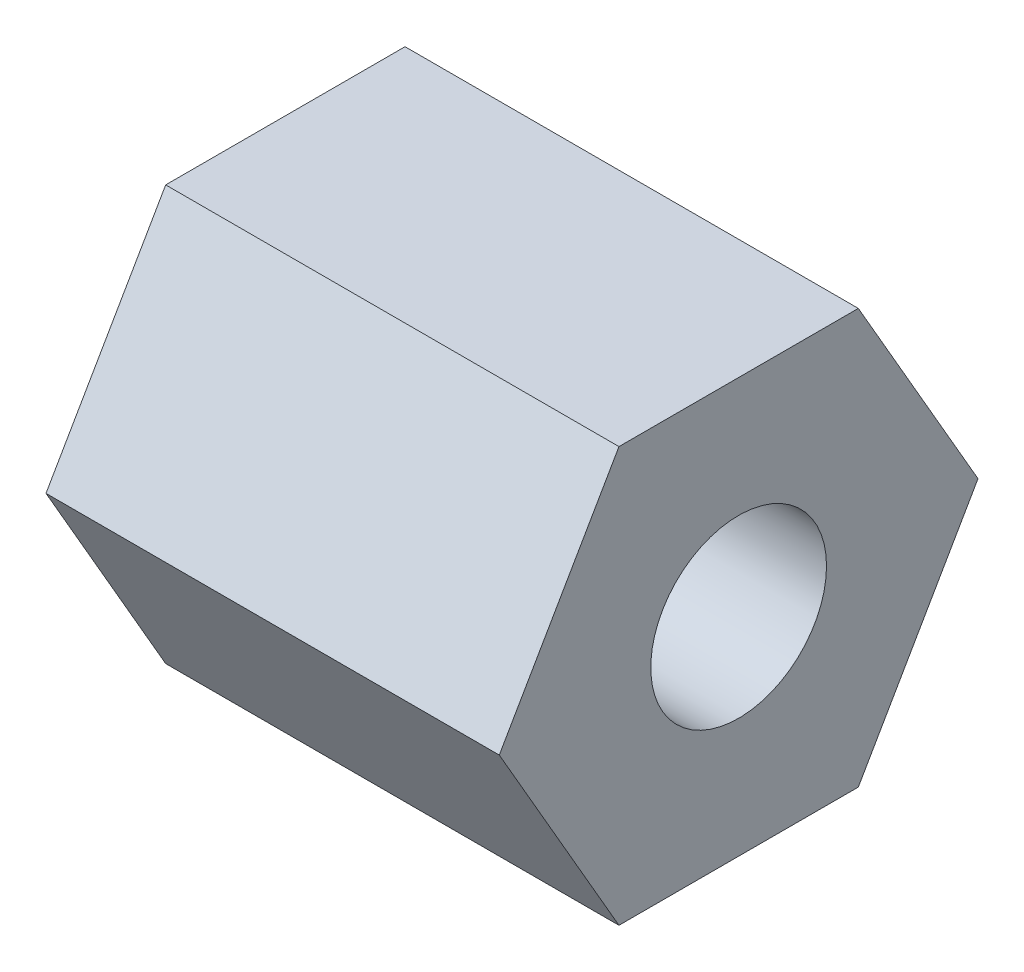
ISO-10303-21;
HEADER;
FILE_DESCRIPTION(('STEP AP214'),'2;1');
FILE_NAME('part.step','',(''),(''),'','','');
FILE_SCHEMA(('AUTOMOTIVE_DESIGN { 1 0 10303 214 1 1 1 1 }'));
ENDSEC;
DATA;
#1=APPLICATION_CONTEXT('core data for automotive mechanical design processes');
#2=APPLICATION_PROTOCOL_DEFINITION('international standard','automotive_design',2000,#1);
#3=PRODUCT_CONTEXT('',#1,'mechanical');
#4=PRODUCT('Part','Part','',(#3));
#5=PRODUCT_RELATED_PRODUCT_CATEGORY('part','',(#4));
#6=PRODUCT_DEFINITION_FORMATION('','',#4);
#7=PRODUCT_DEFINITION_CONTEXT('part definition',#1,'design');
#8=PRODUCT_DEFINITION('design','',#6,#7);
#9=PRODUCT_DEFINITION_SHAPE('','',#8);
#10=(LENGTH_UNIT() NAMED_UNIT(*) SI_UNIT(.MILLI.,.METRE.));
#11=(NAMED_UNIT(*) PLANE_ANGLE_UNIT() SI_UNIT($,.RADIAN.));
#12=(NAMED_UNIT(*) SI_UNIT($,.STERADIAN.) SOLID_ANGLE_UNIT());
#13=UNCERTAINTY_MEASURE_WITH_UNIT(LENGTH_MEASURE(1.E-05),#10,'distance_accuracy_value','');
#14=(GEOMETRIC_REPRESENTATION_CONTEXT(3) GLOBAL_UNCERTAINTY_ASSIGNED_CONTEXT((#13)) GLOBAL_UNIT_ASSIGNED_CONTEXT((#10,
#11,#12)) REPRESENTATION_CONTEXT('',''));
#15=CARTESIAN_POINT('',(0.,0.,0.));
#16=DIRECTION('',(0.,0.,1.));
#17=DIRECTION('',(1.,0.,0.));
#18=AXIS2_PLACEMENT_3D('',#15,#16,#17);
#19=CARTESIAN_POINT('',(38.1,0.,0.));
#20=DIRECTION('',(1.,0.,0.));
#21=DIRECTION('',(0.,1.,0.));
#22=AXIS2_PLACEMENT_3D('',#19,#20,#21);
#23=PLANE('',#22);
#24=CARTESIAN_POINT('',(38.1,0.,0.));
#25=DIRECTION('',(1.,0.,0.));
#26=DIRECTION('',(0.,0.,-1.));
#27=AXIS2_PLACEMENT_3D('',#24,#25,#26);
#28=CIRCLE('',#27,2.0193);
#29=CARTESIAN_POINT('',(38.1,0.,-2.0193));
#30=VERTEX_POINT('',#29);
#31=EDGE_CURVE('E126',#30,#30,#28,.T.);
#32=ORIENTED_EDGE('',*,*,#31,.F.);
#33=EDGE_LOOP('',(#32));
#34=FACE_BOUND('',#33,.T.);
#35=DIRECTION('',(0.,0.866025403784442,-0.5));
#36=VECTOR('',#35,1.);
#37=CARTESIAN_POINT('',(38.1,-4.7625,-2.74963065701564));
#38=LINE('',#37,#36);
#39=CARTESIAN_POINT('',(38.1,-4.7625,-2.74963065701564));
#40=VERTEX_POINT('',#39);
#41=CARTESIAN_POINT('',(38.1,0.,-5.49926131403117));
#42=VERTEX_POINT('',#41);
#43=EDGE_CURVE('E151',#40,#42,#38,.T.);
#44=ORIENTED_EDGE('',*,*,#43,.T.);
#45=DIRECTION('',(0.,0.866025403784438,0.5));
#46=VECTOR('',#45,1.);
#47=CARTESIAN_POINT('',(38.1,0.,-5.49926131403117));
#48=LINE('',#47,#46);
#49=CARTESIAN_POINT('',(38.1,4.7625,-2.74963065701557));
#50=VERTEX_POINT('',#49);
#51=EDGE_CURVE('E99',#42,#50,#48,.T.);
#52=ORIENTED_EDGE('',*,*,#51,.T.);
#53=DIRECTION('',(0.,0.,1.));
#54=VECTOR('',#53,1.);
#55=CARTESIAN_POINT('',(38.1,4.7625,-2.74963065701557));
#56=LINE('',#55,#54);
#57=CARTESIAN_POINT('',(38.1,4.7625,2.7496306570156));
#58=VERTEX_POINT('',#57);
#59=EDGE_CURVE('E140',#50,#58,#56,.T.);
#60=ORIENTED_EDGE('',*,*,#59,.T.);
#61=DIRECTION('',(0.,-0.866025403784442,0.5));
#62=VECTOR('',#61,1.);
#63=CARTESIAN_POINT('',(38.1,4.7625,2.7496306570156));
#64=LINE('',#63,#62);
#65=CARTESIAN_POINT('',(38.1,0.,5.49926131403117));
#66=VERTEX_POINT('',#65);
#67=EDGE_CURVE('E139',#58,#66,#64,.T.);
#68=ORIENTED_EDGE('',*,*,#67,.T.);
#69=DIRECTION('',(0.,-0.866025403784435,-0.500000000000007));
#70=VECTOR('',#69,1.);
#71=CARTESIAN_POINT('',(38.1,0.,5.49926131403117));
#72=LINE('',#71,#70);
#73=CARTESIAN_POINT('',(38.1,-4.7625,2.74963065701554));
#74=VERTEX_POINT('',#73);
#75=EDGE_CURVE('E56',#66,#74,#72,.T.);
#76=ORIENTED_EDGE('',*,*,#75,.T.);
#77=DIRECTION('',(0.,0.,-1.));
#78=VECTOR('',#77,1.);
#79=CARTESIAN_POINT('',(38.1,-4.7625,2.74963065701554));
#80=LINE('',#79,#78);
#81=EDGE_CURVE('E11',#74,#40,#80,.T.);
#82=ORIENTED_EDGE('',*,*,#81,.T.);
#83=EDGE_LOOP('',(#44,#52,#60,#68,#76,#82));
#84=FACE_BOUND('',#83,.T.);
#85=ADVANCED_FACE('F46',(#34,#84),#23,.T.);
#86=CARTESIAN_POINT('',(38.1,-4.7625,2.74963065701554));
#87=DIRECTION('',(0.,1.,0.));
#88=DIRECTION('',(0.,0.,-1.));
#89=AXIS2_PLACEMENT_3D('',#86,#87,#88);
#90=PLANE('',#89);
#91=DIRECTION('',(-1.,0.,0.));
#92=VECTOR('',#91,1.);
#93=CARTESIAN_POINT('',(38.1,-4.7625,2.74963065701554));
#94=LINE('',#93,#92);
#95=CARTESIAN_POINT('',(27.686,-4.7625,2.74963065701555));
#96=VERTEX_POINT('',#95);
#97=EDGE_CURVE('E145',#74,#96,#94,.T.);
#98=ORIENTED_EDGE('',*,*,#97,.T.);
#99=DIRECTION('',(0.,0.,-1.));
#100=VECTOR('',#99,1.);
#101=CARTESIAN_POINT('',(27.686,-4.7625,2.74963065701554));
#102=LINE('',#101,#100);
#103=CARTESIAN_POINT('',(27.686,-4.7625,-2.74963065701564));
#104=VERTEX_POINT('',#103);
#105=EDGE_CURVE('E121',#96,#104,#102,.T.);
#106=ORIENTED_EDGE('',*,*,#105,.T.);
#107=DIRECTION('',(-1.,0.,0.));
#108=VECTOR('',#107,1.);
#109=CARTESIAN_POINT('',(38.1,-4.7625,-2.74963065701564));
#110=LINE('',#109,#108);
#111=EDGE_CURVE('E154',#40,#104,#110,.T.);
#112=ORIENTED_EDGE('',*,*,#111,.F.);
#113=ORIENTED_EDGE('',*,*,#81,.F.);
#114=EDGE_LOOP('',(#98,#106,#112,#113));
#115=FACE_BOUND('',#114,.T.);
#116=ADVANCED_FACE('F175',(#115),#90,.F.);
#117=CARTESIAN_POINT('',(38.1,0.,5.49926131403117));
#118=DIRECTION('',(0.,0.500000000000007,-0.866025403784435));
#119=DIRECTION('',(-1.,0.,0.));
#120=AXIS2_PLACEMENT_3D('',#117,#118,#119);
#121=PLANE('',#120);
#122=DIRECTION('',(-1.,0.,0.));
#123=VECTOR('',#122,1.);
#124=CARTESIAN_POINT('',(38.1,0.,5.49926131403117));
#125=LINE('',#124,#123);
#126=CARTESIAN_POINT('',(27.686,0.,5.49926131403121));
#127=VERTEX_POINT('',#126);
#128=EDGE_CURVE('E132',#66,#127,#125,.T.);
#129=ORIENTED_EDGE('',*,*,#128,.T.);
#130=DIRECTION('',(0.,-0.866025403784435,-0.500000000000007));
#131=VECTOR('',#130,1.);
#132=CARTESIAN_POINT('',(27.686,0.,5.49926131403117));
#133=LINE('',#132,#131);
#134=EDGE_CURVE('E115',#127,#96,#133,.T.);
#135=ORIENTED_EDGE('',*,*,#134,.T.);
#136=ORIENTED_EDGE('',*,*,#97,.F.);
#137=ORIENTED_EDGE('',*,*,#75,.F.);
#138=EDGE_LOOP('',(#129,#135,#136,#137));
#139=FACE_BOUND('',#138,.T.);
#140=ADVANCED_FACE('F48',(#139),#121,.F.);
#141=CARTESIAN_POINT('',(38.1,4.7625,2.7496306570156));
#142=DIRECTION('',(0.,-0.5,-0.866025403784442));
#143=DIRECTION('',(0.,-0.866025403784442,0.5));
#144=AXIS2_PLACEMENT_3D('',#141,#142,#143);
#145=PLANE('',#144);
#146=DIRECTION('',(-1.,0.,0.));
#147=VECTOR('',#146,1.);
#148=CARTESIAN_POINT('',(38.1,4.7625,2.7496306570156));
#149=LINE('',#148,#147);
#150=CARTESIAN_POINT('',(27.686,4.76249999999998,2.74963065701562));
#151=VERTEX_POINT('',#150);
#152=EDGE_CURVE('E134',#58,#151,#149,.T.);
#153=ORIENTED_EDGE('',*,*,#152,.T.);
#154=DIRECTION('',(0.,0.866025403784439,-0.499999999999998));
#155=VECTOR('',#154,1.);
#156=CARTESIAN_POINT('',(27.686,7.14374999999999,1.37481532850782));
#157=LINE('',#156,#155);
#158=EDGE_CURVE('E118',#127,#151,#157,.T.);
#159=ORIENTED_EDGE('',*,*,#158,.F.);
#160=ORIENTED_EDGE('',*,*,#128,.F.);
#161=ORIENTED_EDGE('',*,*,#67,.F.);
#162=EDGE_LOOP('',(#153,#159,#160,#161));
#163=FACE_BOUND('',#162,.T.);
#164=ADVANCED_FACE('F131',(#163),#145,.F.);
#165=CARTESIAN_POINT('',(38.1,4.7625,-2.74963065701557));
#166=DIRECTION('',(0.,-1.,0.));
#167=DIRECTION('',(0.,0.,-1.));
#168=AXIS2_PLACEMENT_3D('',#165,#166,#167);
#169=PLANE('',#168);
#170=DIRECTION('',(-1.,0.,0.));
#171=VECTOR('',#170,1.);
#172=CARTESIAN_POINT('',(38.1,4.7625,-2.74963065701557));
#173=LINE('',#172,#171);
#174=CARTESIAN_POINT('',(27.686,4.7625,-2.74963065701558));
#175=VERTEX_POINT('',#174);
#176=EDGE_CURVE('E170',#50,#175,#173,.T.);
#177=ORIENTED_EDGE('',*,*,#176,.T.);
#178=DIRECTION('',(0.,0.,1.));
#179=VECTOR('',#178,1.);
#180=CARTESIAN_POINT('',(27.686,4.7625,-2.74963065701557));
#181=LINE('',#180,#179);
#182=EDGE_CURVE('E179',#175,#151,#181,.T.);
#183=ORIENTED_EDGE('',*,*,#182,.T.);
#184=ORIENTED_EDGE('',*,*,#152,.F.);
#185=ORIENTED_EDGE('',*,*,#59,.F.);
#186=EDGE_LOOP('',(#177,#183,#184,#185));
#187=FACE_BOUND('',#186,.T.);
#188=ADVANCED_FACE('F213',(#187),#169,.F.);
#189=CARTESIAN_POINT('',(38.1,0.,-5.49926131403117));
#190=DIRECTION('',(0.,-0.5,0.866025403784438));
#191=DIRECTION('',(-1.,0.,0.));
#192=AXIS2_PLACEMENT_3D('',#189,#190,#191);
#193=PLANE('',#192);
#194=DIRECTION('',(-1.,0.,0.));
#195=VECTOR('',#194,1.);
#196=CARTESIAN_POINT('',(38.1,0.,-5.49926131403117));
#197=LINE('',#196,#195);
#198=CARTESIAN_POINT('',(27.686,0.,-5.49926131403117));
#199=VERTEX_POINT('',#198);
#200=EDGE_CURVE('E155',#42,#199,#197,.T.);
#201=ORIENTED_EDGE('',*,*,#200,.T.);
#202=DIRECTION('',(0.,0.866025403784438,0.5));
#203=VECTOR('',#202,1.);
#204=CARTESIAN_POINT('',(27.686,0.,-5.49926131403117));
#205=LINE('',#204,#203);
#206=EDGE_CURVE('E64',#199,#175,#205,.T.);
#207=ORIENTED_EDGE('',*,*,#206,.T.);
#208=ORIENTED_EDGE('',*,*,#176,.F.);
#209=ORIENTED_EDGE('',*,*,#51,.F.);
#210=EDGE_LOOP('',(#201,#207,#208,#209));
#211=FACE_BOUND('',#210,.T.);
#212=ADVANCED_FACE('F239',(#211),#193,.F.);
#213=CARTESIAN_POINT('',(38.1,-4.7625,-2.74963065701564));
#214=DIRECTION('',(0.,0.5,0.866025403784442));
#215=DIRECTION('',(1.,0.,0.));
#216=AXIS2_PLACEMENT_3D('',#213,#214,#215);
#217=PLANE('',#216);
#218=ORIENTED_EDGE('',*,*,#111,.T.);
#219=DIRECTION('',(0.,0.866025403784439,-0.499999999999999));
#220=VECTOR('',#219,1.);
#221=CARTESIAN_POINT('',(27.686,-4.7625,-2.74963065701564));
#222=LINE('',#221,#220);
#223=EDGE_CURVE('E183',#104,#199,#222,.T.);
#224=ORIENTED_EDGE('',*,*,#223,.T.);
#225=ORIENTED_EDGE('',*,*,#200,.F.);
#226=ORIENTED_EDGE('',*,*,#43,.F.);
#227=EDGE_LOOP('',(#218,#224,#225,#226));
#228=FACE_BOUND('',#227,.T.);
#229=ADVANCED_FACE('F182',(#228),#217,.F.);
#230=CARTESIAN_POINT('',(-38.1,0.,0.));
#231=DIRECTION('',(-1.,0.,0.));
#232=DIRECTION('',(0.,0.,1.));
#233=AXIS2_PLACEMENT_3D('',#230,#231,#232);
#234=CYLINDRICAL_SURFACE('',#233,2.0193);
#235=CARTESIAN_POINT('',(27.686,0.,0.));
#236=DIRECTION('',(1.,0.,0.));
#237=DIRECTION('',(0.,0.,-1.));
#238=AXIS2_PLACEMENT_3D('',#235,#236,#237);
#239=CIRCLE('',#238,2.0193);
#240=CARTESIAN_POINT('',(27.686,0.,-2.0193));
#241=VERTEX_POINT('',#240);
#242=EDGE_CURVE('E50',#241,#241,#239,.F.);
#243=ORIENTED_EDGE('',*,*,#242,.T.);
#244=EDGE_LOOP('',(#243));
#245=FACE_BOUND('',#244,.T.);
#246=ORIENTED_EDGE('',*,*,#31,.T.);
#247=EDGE_LOOP('',(#246));
#248=FACE_BOUND('',#247,.T.);
#249=ADVANCED_FACE('F227',(#245,#248),#234,.F.);
#250=CARTESIAN_POINT('',(27.686,1.19062500000001,-8.93629963530066));
#251=DIRECTION('',(1.,0.,0.));
#252=DIRECTION('',(0.,0.,-1.));
#253=AXIS2_PLACEMENT_3D('',#250,#251,#252);
#254=PLANE('',#253);
#255=ORIENTED_EDGE('',*,*,#242,.F.);
#256=EDGE_LOOP('',(#255));
#257=FACE_BOUND('',#256,.T.);
#258=ORIENTED_EDGE('',*,*,#158,.T.);
#259=ORIENTED_EDGE('',*,*,#182,.F.);
#260=ORIENTED_EDGE('',*,*,#206,.F.);
#261=ORIENTED_EDGE('',*,*,#223,.F.);
#262=ORIENTED_EDGE('',*,*,#105,.F.);
#263=ORIENTED_EDGE('',*,*,#134,.F.);
#264=EDGE_LOOP('',(#258,#259,#260,#261,#262,#263));
#265=FACE_BOUND('',#264,.T.);
#266=ADVANCED_FACE('F117',(#257,#265),#254,.F.);
#267=CLOSED_SHELL('',(#85,#116,#140,#164,#188,#212,#229,#249,#266));
#268=MANIFOLD_SOLID_BREP('B2',#267);
#269=ADVANCED_BREP_SHAPE_REPRESENTATION('',(#18,#268),#14);
#270=SHAPE_DEFINITION_REPRESENTATION(#9,#269);
ENDSEC;
END-ISO-10303-21;
